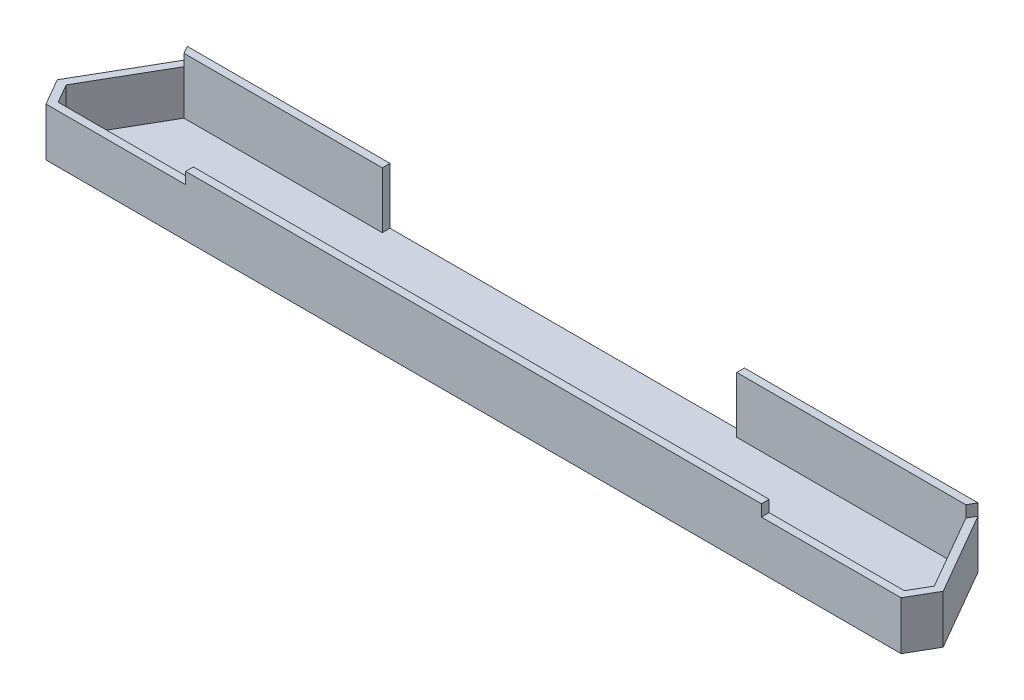
ISO-10303-21;
HEADER;
FILE_DESCRIPTION(('STEP AP214'),'2;1');
FILE_NAME('part.step','',(''),(''),'','','');
FILE_SCHEMA(('AUTOMOTIVE_DESIGN { 1 0 10303 214 1 1 1 1 }'));
ENDSEC;
DATA;
#1=APPLICATION_CONTEXT('core data for automotive mechanical design processes');
#2=APPLICATION_PROTOCOL_DEFINITION('international standard','automotive_design',2000,#1);
#3=PRODUCT_CONTEXT('',#1,'mechanical');
#4=PRODUCT('Part','Part','',(#3));
#5=PRODUCT_RELATED_PRODUCT_CATEGORY('part','',(#4));
#6=PRODUCT_DEFINITION_FORMATION('','',#4);
#7=PRODUCT_DEFINITION_CONTEXT('part definition',#1,'design');
#8=PRODUCT_DEFINITION('design','',#6,#7);
#9=PRODUCT_DEFINITION_SHAPE('','',#8);
#10=(LENGTH_UNIT() NAMED_UNIT(*) SI_UNIT(.MILLI.,.METRE.));
#11=(NAMED_UNIT(*) PLANE_ANGLE_UNIT() SI_UNIT($,.RADIAN.));
#12=(NAMED_UNIT(*) SI_UNIT($,.STERADIAN.) SOLID_ANGLE_UNIT());
#13=UNCERTAINTY_MEASURE_WITH_UNIT(LENGTH_MEASURE(1.E-05),#10,'distance_accuracy_value','');
#14=(GEOMETRIC_REPRESENTATION_CONTEXT(3) GLOBAL_UNCERTAINTY_ASSIGNED_CONTEXT((#13)) GLOBAL_UNIT_ASSIGNED_CONTEXT((#10,
#11,#12)) REPRESENTATION_CONTEXT('',''));
#15=CARTESIAN_POINT('',(0.,0.,0.));
#16=DIRECTION('',(0.,0.,1.));
#17=DIRECTION('',(1.,0.,0.));
#18=AXIS2_PLACEMENT_3D('',#15,#16,#17);
#19=CARTESIAN_POINT('',(0.,1.,0.));
#20=DIRECTION('',(0.,1.,0.));
#21=DIRECTION('',(0.,0.,1.));
#22=AXIS2_PLACEMENT_3D('',#19,#20,#21);
#23=PLANE('',#22);
#24=DIRECTION('',(1.,0.,0.));
#25=VECTOR('',#24,1.);
#26=CARTESIAN_POINT('',(-1.90825575538562E-13,1.,-19.391796769725));
#27=LINE('',#26,#25);
#28=CARTESIAN_POINT('',(-101.49473983817,1.,-19.3917967697245));
#29=VERTEX_POINT('',#28);
#30=CARTESIAN_POINT('',(-50.01,1.,-19.3917967697245));
#31=VERTEX_POINT('',#30);
#32=EDGE_CURVE('E355',#29,#31,#27,.T.);
#33=ORIENTED_EDGE('',*,*,#32,.F.);
#34=DIRECTION('',(0.500000000000004,0.,-0.866025403784436));
#35=VECTOR('',#34,1.);
#36=CARTESIAN_POINT('',(-84.5179491924306,1.,-48.7964607176055));
#37=LINE('',#36,#35);
#38=CARTESIAN_POINT('',(-112.690598923241,1.,0.));
#39=VERTEX_POINT('',#38);
#40=EDGE_CURVE('E357',#39,#29,#37,.T.);
#41=ORIENTED_EDGE('',*,*,#40,.F.);
#42=DIRECTION('',(0.499999999999998,0.,0.86602540378444));
#43=VECTOR('',#42,1.);
#44=CARTESIAN_POINT('',(-84.5179491924314,1.,48.7964607176051));
#45=LINE('',#44,#43);
#46=CARTESIAN_POINT('',(-109.845299461621,1.,4.92820323027554));
#47=VERTEX_POINT('',#46);
#48=EDGE_CURVE('E359',#39,#47,#45,.T.);
#49=ORIENTED_EDGE('',*,*,#48,.T.);
#50=DIRECTION('',(1.,0.,0.));
#51=VECTOR('',#50,1.);
#52=CARTESIAN_POINT('',(0.,1.,4.92820323027551));
#53=LINE('',#52,#51);
#54=CARTESIAN_POINT('',(109.845299461621,1.,4.92820323027552));
#55=VERTEX_POINT('',#54);
#56=EDGE_CURVE('E57',#47,#55,#53,.T.);
#57=ORIENTED_EDGE('',*,*,#56,.T.);
#58=DIRECTION('',(-0.500000000000268,0.,0.866025403784284));
#59=VECTOR('',#58,1.);
#60=CARTESIAN_POINT('',(84.5179491924025,1.,48.7964607176236));
#61=LINE('',#60,#59);
#62=CARTESIAN_POINT('',(112.690598923244,1.,0.));
#63=VERTEX_POINT('',#62);
#64=EDGE_CURVE('E47',#63,#55,#61,.T.);
#65=ORIENTED_EDGE('',*,*,#64,.F.);
#66=DIRECTION('',(0.500000000000073,0.,0.866025403784397));
#67=VECTOR('',#66,1.);
#68=CARTESIAN_POINT('',(84.5179491924244,1.,-48.7964607176109));
#69=LINE('',#68,#67);
#70=CARTESIAN_POINT('',(101.49473983817,1.,-19.3917967697245));
#71=VERTEX_POINT('',#70);
#72=EDGE_CURVE('E11',#71,#63,#69,.T.);
#73=ORIENTED_EDGE('',*,*,#72,.F.);
#74=DIRECTION('',(1.,0.,0.));
#75=VECTOR('',#74,1.);
#76=CARTESIAN_POINT('',(3.08770202801175E-13,1.,-19.3917967697261));
#77=LINE('',#76,#75);
#78=CARTESIAN_POINT('',(42.01,1.,-19.3917967697254));
#79=VERTEX_POINT('',#78);
#80=EDGE_CURVE('E265',#79,#71,#77,.T.);
#81=ORIENTED_EDGE('',*,*,#80,.F.);
#82=DIRECTION('',(0.,0.,-1.));
#83=VECTOR('',#82,1.);
#84=CARTESIAN_POINT('',(42.01,1.,0.));
#85=LINE('',#84,#83);
#86=CARTESIAN_POINT('',(42.01,1.,-21.3917967697248));
#87=VERTEX_POINT('',#86);
#88=EDGE_CURVE('E189',#79,#87,#85,.T.);
#89=ORIENTED_EDGE('',*,*,#88,.T.);
#90=DIRECTION('',(1.,0.,0.));
#91=VECTOR('',#90,1.);
#92=CARTESIAN_POINT('',(0.,1.,-21.3917967697248));
#93=LINE('',#92,#91);
#94=CARTESIAN_POINT('',(-50.01,1.,-21.3917967697248));
#95=VERTEX_POINT('',#94);
#96=EDGE_CURVE('E183',#95,#87,#93,.T.);
#97=ORIENTED_EDGE('',*,*,#96,.F.);
#98=DIRECTION('',(0.,0.,1.));
#99=VECTOR('',#98,1.);
#100=CARTESIAN_POINT('',(-50.0099999999999,1.,1.73507042067174E-13));
#101=LINE('',#100,#99);
#102=EDGE_CURVE('E186',#95,#31,#101,.T.);
#103=ORIENTED_EDGE('',*,*,#102,.T.);
#104=EDGE_LOOP('',(#33,#41,#49,#57,#65,#73,#81,#89,#97,#103));
#105=FACE_BOUND('',#104,.T.);
#106=ADVANCED_FACE('F39',(#105),#23,.T.);
#107=CARTESIAN_POINT('',(0.,0.,0.));
#108=DIRECTION('',(0.,1.,0.));
#109=DIRECTION('',(0.,0.,1.));
#110=AXIS2_PLACEMENT_3D('',#107,#108,#109);
#111=PLANE('',#110);
#112=DIRECTION('',(0.50000000000002,0.,-0.866025403784427));
#113=VECTOR('',#112,1.);
#114=CARTESIAN_POINT('',(-86.2499999999977,0.,-49.7964607176066));
#115=LINE('',#114,#113);
#116=CARTESIAN_POINT('',(-115.,0.,0.));
#117=VERTEX_POINT('',#116);
#118=CARTESIAN_POINT('',(-102.649440376549,0.,-21.3917967697245));
#119=VERTEX_POINT('',#118);
#120=EDGE_CURVE('E335',#117,#119,#115,.T.);
#121=ORIENTED_EDGE('',*,*,#120,.T.);
#122=DIRECTION('',(1.,0.,0.));
#123=VECTOR('',#122,1.);
#124=CARTESIAN_POINT('',(0.,0.,-21.391796769725));
#125=LINE('',#124,#123);
#126=CARTESIAN_POINT('',(102.649440376549,0.,-21.3917967697245));
#127=VERTEX_POINT('',#126);
#128=EDGE_CURVE('E240',#119,#127,#125,.T.);
#129=ORIENTED_EDGE('',*,*,#128,.T.);
#130=DIRECTION('',(0.500000000000021,0.,0.866025403784426));
#131=VECTOR('',#130,1.);
#132=CARTESIAN_POINT('',(86.2499999999976,0.,-49.7964607176066));
#133=LINE('',#132,#131);
#134=CARTESIAN_POINT('',(115.,0.,0.));
#135=VERTEX_POINT('',#134);
#136=EDGE_CURVE('E272',#127,#135,#133,.T.);
#137=ORIENTED_EDGE('',*,*,#136,.T.);
#138=DIRECTION('',(-0.5,0.,0.866025403784439));
#139=VECTOR('',#138,1.);
#140=CARTESIAN_POINT('',(86.25,0.,49.7964607176052));
#141=LINE('',#140,#139);
#142=CARTESIAN_POINT('',(111.,0.,6.92820323027546));
#143=VERTEX_POINT('',#142);
#144=EDGE_CURVE('E267',#135,#143,#141,.T.);
#145=ORIENTED_EDGE('',*,*,#144,.T.);
#146=DIRECTION('',(1.,0.,0.));
#147=VECTOR('',#146,1.);
#148=CARTESIAN_POINT('',(0.,0.,6.92820323027569));
#149=LINE('',#148,#147);
#150=CARTESIAN_POINT('',(-111.,0.,6.92820323027545));
#151=VERTEX_POINT('',#150);
#152=EDGE_CURVE('E310',#151,#143,#149,.T.);
#153=ORIENTED_EDGE('',*,*,#152,.F.);
#154=DIRECTION('',(0.500000000000017,0.,0.866025403784429));
#155=VECTOR('',#154,1.);
#156=CARTESIAN_POINT('',(-86.249999999998,0.,49.7964607176064));
#157=LINE('',#156,#155);
#158=EDGE_CURVE('E314',#117,#151,#157,.T.);
#159=ORIENTED_EDGE('',*,*,#158,.F.);
#160=EDGE_LOOP('',(#121,#129,#137,#145,#153,#159));
#161=FACE_BOUND('',#160,.T.);
#162=ADVANCED_FACE('F41',(#161),#111,.F.);
#163=CARTESIAN_POINT('',(0.,12.58,6.92820323027569));
#164=DIRECTION('',(0.,0.,-1.));
#165=DIRECTION('',(-1.,0.,0.));
#166=AXIS2_PLACEMENT_3D('',#163,#164,#165);
#167=PLANE('',#166);
#168=ORIENTED_EDGE('',*,*,#152,.T.);
#169=DIRECTION('',(0.,-1.,0.));
#170=VECTOR('',#169,1.);
#171=CARTESIAN_POINT('',(111.,12.58,6.92820323027546));
#172=LINE('',#171,#170);
#173=CARTESIAN_POINT('',(111.,12.58,6.92820323027546));
#174=VERTEX_POINT('',#173);
#175=EDGE_CURVE('E307',#174,#143,#172,.T.);
#176=ORIENTED_EDGE('',*,*,#175,.F.);
#177=DIRECTION('',(-1.,0.,0.));
#178=VECTOR('',#177,1.);
#179=CARTESIAN_POINT('',(0.,12.58,6.92820323027567));
#180=LINE('',#179,#178);
#181=CARTESIAN_POINT('',(74.74,12.58,6.92820323027553));
#182=VERTEX_POINT('',#181);
#183=EDGE_CURVE('E271',#174,#182,#180,.T.);
#184=ORIENTED_EDGE('',*,*,#183,.T.);
#185=DIRECTION('',(0.,-1.,0.));
#186=VECTOR('',#185,1.);
#187=CARTESIAN_POINT('',(74.74,15.58,6.92820323027553));
#188=LINE('',#187,#186);
#189=CARTESIAN_POINT('',(74.74,15.58,6.92820323027553));
#190=VERTEX_POINT('',#189);
#191=EDGE_CURVE('E237',#190,#182,#188,.T.);
#192=ORIENTED_EDGE('',*,*,#191,.F.);
#193=DIRECTION('',(-1.,0.,0.));
#194=VECTOR('',#193,1.);
#195=CARTESIAN_POINT('',(0.,15.58,6.92820323027553));
#196=LINE('',#195,#194);
#197=CARTESIAN_POINT('',(-74.74,15.58,6.92820323027553));
#198=VERTEX_POINT('',#197);
#199=EDGE_CURVE('E217',#190,#198,#196,.T.);
#200=ORIENTED_EDGE('',*,*,#199,.T.);
#201=DIRECTION('',(0.,-1.,0.));
#202=VECTOR('',#201,1.);
#203=CARTESIAN_POINT('',(-74.74,15.58,6.92820323027553));
#204=LINE('',#203,#202);
#205=CARTESIAN_POINT('',(-74.74,12.58,6.92820323027553));
#206=VERTEX_POINT('',#205);
#207=EDGE_CURVE('E228',#198,#206,#204,.T.);
#208=ORIENTED_EDGE('',*,*,#207,.T.);
#209=DIRECTION('',(1.,0.,0.));
#210=VECTOR('',#209,1.);
#211=CARTESIAN_POINT('',(0.,12.58,6.92820323027569));
#212=LINE('',#211,#210);
#213=CARTESIAN_POINT('',(-111.,12.58,6.92820323027545));
#214=VERTEX_POINT('',#213);
#215=EDGE_CURVE('E311',#214,#206,#212,.T.);
#216=ORIENTED_EDGE('',*,*,#215,.F.);
#217=DIRECTION('',(0.,-1.,0.));
#218=VECTOR('',#217,1.);
#219=CARTESIAN_POINT('',(-111.,12.58,6.92820323027545));
#220=LINE('',#219,#218);
#221=EDGE_CURVE('E333',#214,#151,#220,.T.);
#222=ORIENTED_EDGE('',*,*,#221,.T.);
#223=EDGE_LOOP('',(#168,#176,#184,#192,#200,#208,#216,#222));
#224=FACE_BOUND('',#223,.T.);
#225=ADVANCED_FACE('F378',(#224),#167,.F.);
#226=CARTESIAN_POINT('',(0.,12.58,4.92820323027551));
#227=DIRECTION('',(0.,0.,-1.));
#228=DIRECTION('',(-1.,0.,0.));
#229=AXIS2_PLACEMENT_3D('',#226,#227,#228);
#230=PLANE('',#229);
#231=DIRECTION('',(1.,0.,0.));
#232=VECTOR('',#231,1.);
#233=CARTESIAN_POINT('',(0.,12.58,4.92820323027551));
#234=LINE('',#233,#232);
#235=CARTESIAN_POINT('',(-109.845299461621,12.58,4.92820323027554));
#236=VERTEX_POINT('',#235);
#237=CARTESIAN_POINT('',(-74.74,12.58,4.92820323027553));
#238=VERTEX_POINT('',#237);
#239=EDGE_CURVE('E316',#236,#238,#234,.T.);
#240=ORIENTED_EDGE('',*,*,#239,.T.);
#241=DIRECTION('',(0.,-1.,0.));
#242=VECTOR('',#241,1.);
#243=CARTESIAN_POINT('',(-74.74,15.58,4.92820323027553));
#244=LINE('',#243,#242);
#245=CARTESIAN_POINT('',(-74.74,15.58,4.92820323027553));
#246=VERTEX_POINT('',#245);
#247=EDGE_CURVE('E231',#246,#238,#244,.T.);
#248=ORIENTED_EDGE('',*,*,#247,.F.);
#249=DIRECTION('',(1.,0.,0.));
#250=VECTOR('',#249,1.);
#251=CARTESIAN_POINT('',(0.,15.58,4.92820323027553));
#252=LINE('',#251,#250);
#253=CARTESIAN_POINT('',(74.74,15.58,4.92820323027553));
#254=VERTEX_POINT('',#253);
#255=EDGE_CURVE('E222',#246,#254,#252,.T.);
#256=ORIENTED_EDGE('',*,*,#255,.T.);
#257=DIRECTION('',(0.,-1.,0.));
#258=VECTOR('',#257,1.);
#259=CARTESIAN_POINT('',(74.74,15.58,4.92820323027553));
#260=LINE('',#259,#258);
#261=CARTESIAN_POINT('',(74.74,12.58,4.92820323027553));
#262=VERTEX_POINT('',#261);
#263=EDGE_CURVE('E234',#254,#262,#260,.T.);
#264=ORIENTED_EDGE('',*,*,#263,.T.);
#265=DIRECTION('',(-1.,0.,0.));
#266=VECTOR('',#265,1.);
#267=CARTESIAN_POINT('',(0.,12.58,4.92820323027554));
#268=LINE('',#267,#266);
#269=CARTESIAN_POINT('',(109.845299461621,12.58,4.92820323027552));
#270=VERTEX_POINT('',#269);
#271=EDGE_CURVE('E288',#270,#262,#268,.T.);
#272=ORIENTED_EDGE('',*,*,#271,.F.);
#273=DIRECTION('',(0.,-1.,0.));
#274=VECTOR('',#273,1.);
#275=CARTESIAN_POINT('',(109.845299461621,12.58,4.92820323027552));
#276=LINE('',#275,#274);
#277=EDGE_CURVE('E290',#270,#55,#276,.T.);
#278=ORIENTED_EDGE('',*,*,#277,.T.);
#279=ORIENTED_EDGE('',*,*,#56,.F.);
#280=DIRECTION('',(0.,-1.,0.));
#281=VECTOR('',#280,1.);
#282=CARTESIAN_POINT('',(-109.845299461621,12.58,4.92820323027554));
#283=LINE('',#282,#281);
#284=EDGE_CURVE('E352',#236,#47,#283,.T.);
#285=ORIENTED_EDGE('',*,*,#284,.F.);
#286=EDGE_LOOP('',(#240,#248,#256,#264,#272,#278,#279,#285));
#287=FACE_BOUND('',#286,.T.);
#288=ADVANCED_FACE('F368',(#287),#230,.T.);
#289=CARTESIAN_POINT('',(-84.5179491924314,12.58,48.7964607176051));
#290=DIRECTION('',(0.86602540378444,0.,-0.499999999999998));
#291=DIRECTION('',(-0.499999999999998,0.,-0.86602540378444));
#292=AXIS2_PLACEMENT_3D('',#289,#290,#291);
#293=PLANE('',#292);
#294=ORIENTED_EDGE('',*,*,#284,.T.);
#295=ORIENTED_EDGE('',*,*,#48,.F.);
#296=DIRECTION('',(0.,-1.,0.));
#297=VECTOR('',#296,1.);
#298=CARTESIAN_POINT('',(-112.690598923241,12.58,0.));
#299=LINE('',#298,#297);
#300=CARTESIAN_POINT('',(-112.690598923241,12.58,0.));
#301=VERTEX_POINT('',#300);
#302=EDGE_CURVE('E349',#301,#39,#299,.T.);
#303=ORIENTED_EDGE('',*,*,#302,.F.);
#304=DIRECTION('',(0.499999999999998,0.,0.86602540378444));
#305=VECTOR('',#304,1.);
#306=CARTESIAN_POINT('',(-84.5179491924314,12.58,48.7964607176051));
#307=LINE('',#306,#305);
#308=EDGE_CURVE('E319',#301,#236,#307,.T.);
#309=ORIENTED_EDGE('',*,*,#308,.T.);
#310=EDGE_LOOP('',(#294,#295,#303,#309));
#311=FACE_BOUND('',#310,.T.);
#312=ADVANCED_FACE('F423',(#311),#293,.T.);
#313=CARTESIAN_POINT('',(-84.5179491924306,12.58,-48.7964607176055));
#314=DIRECTION('',(-0.866025403784436,0.,-0.500000000000004));
#315=DIRECTION('',(-0.500000000000004,0.,0.866025403784436));
#316=AXIS2_PLACEMENT_3D('',#313,#314,#315);
#317=PLANE('',#316);
#318=ORIENTED_EDGE('',*,*,#40,.T.);
#319=DIRECTION('',(0.,-1.,0.));
#320=VECTOR('',#319,1.);
#321=CARTESIAN_POINT('',(-101.49473983817,12.58,-19.3917967697245));
#322=LINE('',#321,#320);
#323=CARTESIAN_POINT('',(-101.49473983817,12.58,-19.3917967697245));
#324=VERTEX_POINT('',#323);
#325=EDGE_CURVE('E346',#324,#29,#322,.T.);
#326=ORIENTED_EDGE('',*,*,#325,.F.);
#327=DIRECTION('',(0.500000000000004,0.,-0.866025403784436));
#328=VECTOR('',#327,1.);
#329=CARTESIAN_POINT('',(-84.5179491924306,12.58,-48.7964607176055));
#330=LINE('',#329,#328);
#331=EDGE_CURVE('E322',#301,#324,#330,.T.);
#332=ORIENTED_EDGE('',*,*,#331,.F.);
#333=ORIENTED_EDGE('',*,*,#302,.T.);
#334=EDGE_LOOP('',(#318,#326,#332,#333));
#335=FACE_BOUND('',#334,.T.);
#336=ADVANCED_FACE('F426',(#335),#317,.F.);
#337=CARTESIAN_POINT('',(-86.2499999999977,12.58,-49.7964607176066));
#338=DIRECTION('',(-0.866025403784427,0.,-0.50000000000002));
#339=DIRECTION('',(-0.50000000000002,0.,0.866025403784427));
#340=AXIS2_PLACEMENT_3D('',#337,#338,#339);
#341=PLANE('',#340);
#342=ORIENTED_EDGE('',*,*,#120,.F.);
#343=DIRECTION('',(0.,-1.,0.));
#344=VECTOR('',#343,1.);
#345=CARTESIAN_POINT('',(-115.,12.58,0.));
#346=LINE('',#345,#344);
#347=CARTESIAN_POINT('',(-115.,12.58,0.));
#348=VERTEX_POINT('',#347);
#349=EDGE_CURVE('E341',#348,#117,#346,.T.);
#350=ORIENTED_EDGE('',*,*,#349,.F.);
#351=DIRECTION('',(0.50000000000002,0.,-0.866025403784427));
#352=VECTOR('',#351,1.);
#353=CARTESIAN_POINT('',(-86.2499999999977,12.58,-49.7964607176066));
#354=LINE('',#353,#352);
#355=CARTESIAN_POINT('',(-102.649440376549,12.58,-21.3917967697245));
#356=VERTEX_POINT('',#355);
#357=EDGE_CURVE('E328',#348,#356,#354,.T.);
#358=ORIENTED_EDGE('',*,*,#357,.T.);
#359=DIRECTION('',(0.,-1.,0.));
#360=VECTOR('',#359,1.);
#361=CARTESIAN_POINT('',(-102.649440376549,12.58,-21.3917967697245));
#362=LINE('',#361,#360);
#363=EDGE_CURVE('E343',#356,#119,#362,.T.);
#364=ORIENTED_EDGE('',*,*,#363,.T.);
#365=EDGE_LOOP('',(#342,#350,#358,#364));
#366=FACE_BOUND('',#365,.T.);
#367=ADVANCED_FACE('F430',(#366),#341,.T.);
#368=CARTESIAN_POINT('',(-86.249999999998,12.58,49.7964607176064));
#369=DIRECTION('',(0.866025403784429,0.,-0.500000000000017));
#370=DIRECTION('',(-0.500000000000017,0.,-0.866025403784429));
#371=AXIS2_PLACEMENT_3D('',#368,#369,#370);
#372=PLANE('',#371);
#373=ORIENTED_EDGE('',*,*,#158,.T.);
#374=ORIENTED_EDGE('',*,*,#221,.F.);
#375=DIRECTION('',(0.500000000000017,0.,0.866025403784429));
#376=VECTOR('',#375,1.);
#377=CARTESIAN_POINT('',(-86.249999999998,12.58,49.7964607176064));
#378=LINE('',#377,#376);
#379=EDGE_CURVE('E331',#348,#214,#378,.T.);
#380=ORIENTED_EDGE('',*,*,#379,.F.);
#381=ORIENTED_EDGE('',*,*,#349,.T.);
#382=EDGE_LOOP('',(#373,#374,#380,#381));
#383=FACE_BOUND('',#382,.T.);
#384=ADVANCED_FACE('F434',(#383),#372,.F.);
#385=CARTESIAN_POINT('',(0.,12.58,0.));
#386=DIRECTION('',(0.,1.,0.));
#387=DIRECTION('',(0.,0.,1.));
#388=AXIS2_PLACEMENT_3D('',#385,#386,#387);
#389=PLANE('',#388);
#390=ORIENTED_EDGE('',*,*,#215,.T.);
#391=DIRECTION('',(0.,0.,-1.));
#392=VECTOR('',#391,1.);
#393=CARTESIAN_POINT('',(-74.74,12.58,0.));
#394=LINE('',#393,#392);
#395=EDGE_CURVE('E313',#206,#238,#394,.T.);
#396=ORIENTED_EDGE('',*,*,#395,.T.);
#397=ORIENTED_EDGE('',*,*,#239,.F.);
#398=ORIENTED_EDGE('',*,*,#308,.F.);
#399=ORIENTED_EDGE('',*,*,#331,.T.);
#400=DIRECTION('',(0.499999999999805,0.,0.866025403784551));
#401=VECTOR('',#400,1.);
#402=CARTESIAN_POINT('',(-67.7241605648466,12.58,39.1005623327353));
#403=LINE('',#402,#401);
#404=EDGE_CURVE('E325',#356,#324,#403,.T.);
#405=ORIENTED_EDGE('',*,*,#404,.F.);
#406=ORIENTED_EDGE('',*,*,#357,.F.);
#407=ORIENTED_EDGE('',*,*,#379,.T.);
#408=EDGE_LOOP('',(#390,#396,#397,#398,#399,#405,#406,#407));
#409=FACE_BOUND('',#408,.T.);
#410=ADVANCED_FACE('F438',(#409),#389,.T.);
#411=CARTESIAN_POINT('',(86.25,12.58,49.7964607176052));
#412=DIRECTION('',(0.866025403784439,0.,0.5));
#413=DIRECTION('',(0.5,0.,-0.866025403784439));
#414=AXIS2_PLACEMENT_3D('',#411,#412,#413);
#415=PLANE('',#414);
#416=ORIENTED_EDGE('',*,*,#144,.F.);
#417=DIRECTION('',(0.,-1.,0.));
#418=VECTOR('',#417,1.);
#419=CARTESIAN_POINT('',(115.,12.58,0.));
#420=LINE('',#419,#418);
#421=CARTESIAN_POINT('',(115.,12.58,0.));
#422=VERTEX_POINT('',#421);
#423=EDGE_CURVE('E305',#422,#135,#420,.T.);
#424=ORIENTED_EDGE('',*,*,#423,.F.);
#425=DIRECTION('',(-0.5,0.,0.866025403784439));
#426=VECTOR('',#425,1.);
#427=CARTESIAN_POINT('',(86.25,12.58,49.7964607176052));
#428=LINE('',#427,#426);
#429=EDGE_CURVE('E275',#422,#174,#428,.T.);
#430=ORIENTED_EDGE('',*,*,#429,.T.);
#431=ORIENTED_EDGE('',*,*,#175,.T.);
#432=EDGE_LOOP('',(#416,#424,#430,#431));
#433=FACE_BOUND('',#432,.T.);
#434=ADVANCED_FACE('F384',(#433),#415,.T.);
#435=CARTESIAN_POINT('',(86.2499999999976,12.58,-49.7964607176066));
#436=DIRECTION('',(0.866025403784426,0.,-0.500000000000021));
#437=DIRECTION('',(-0.500000000000021,0.,-0.866025403784426));
#438=AXIS2_PLACEMENT_3D('',#435,#436,#437);
#439=PLANE('',#438);
#440=ORIENTED_EDGE('',*,*,#136,.F.);
#441=DIRECTION('',(0.,-1.,0.));
#442=VECTOR('',#441,1.);
#443=CARTESIAN_POINT('',(102.649440376549,12.58,-21.3917967697245));
#444=LINE('',#443,#442);
#445=CARTESIAN_POINT('',(102.649440376549,12.58,-21.3917967697245));
#446=VERTEX_POINT('',#445);
#447=EDGE_CURVE('E303',#446,#127,#444,.T.);
#448=ORIENTED_EDGE('',*,*,#447,.F.);
#449=DIRECTION('',(0.500000000000021,0.,0.866025403784426));
#450=VECTOR('',#449,1.);
#451=CARTESIAN_POINT('',(86.2499999999976,12.58,-49.7964607176066));
#452=LINE('',#451,#450);
#453=EDGE_CURVE('E278',#446,#422,#452,.T.);
#454=ORIENTED_EDGE('',*,*,#453,.T.);
#455=ORIENTED_EDGE('',*,*,#423,.T.);
#456=EDGE_LOOP('',(#440,#448,#454,#455));
#457=FACE_BOUND('',#456,.T.);
#458=ADVANCED_FACE('F387',(#457),#439,.T.);
#459=CARTESIAN_POINT('',(84.5179491924244,12.58,-48.7964607176109));
#460=DIRECTION('',(0.866025403784396,0.,-0.500000000000073));
#461=DIRECTION('',(-0.500000000000073,0.,-0.866025403784397));
#462=AXIS2_PLACEMENT_3D('',#459,#460,#461);
#463=PLANE('',#462);
#464=ORIENTED_EDGE('',*,*,#72,.T.);
#465=DIRECTION('',(0.,-1.,0.));
#466=VECTOR('',#465,1.);
#467=CARTESIAN_POINT('',(112.690598923244,12.58,0.));
#468=LINE('',#467,#466);
#469=CARTESIAN_POINT('',(112.690598923244,12.58,0.));
#470=VERTEX_POINT('',#469);
#471=EDGE_CURVE('E297',#470,#63,#468,.T.);
#472=ORIENTED_EDGE('',*,*,#471,.F.);
#473=DIRECTION('',(0.500000000000073,0.,0.866025403784397));
#474=VECTOR('',#473,1.);
#475=CARTESIAN_POINT('',(84.5179491924244,12.58,-48.7964607176109));
#476=LINE('',#475,#474);
#477=CARTESIAN_POINT('',(101.49473983817,12.58,-19.3917967697245));
#478=VERTEX_POINT('',#477);
#479=EDGE_CURVE('E284',#478,#470,#476,.T.);
#480=ORIENTED_EDGE('',*,*,#479,.F.);
#481=DIRECTION('',(0.,-1.,0.));
#482=VECTOR('',#481,1.);
#483=CARTESIAN_POINT('',(101.49473983817,12.58,-19.3917967697245));
#484=LINE('',#483,#482);
#485=EDGE_CURVE('E300',#478,#71,#484,.T.);
#486=ORIENTED_EDGE('',*,*,#485,.T.);
#487=EDGE_LOOP('',(#464,#472,#480,#486));
#488=FACE_BOUND('',#487,.T.);
#489=ADVANCED_FACE('F392',(#488),#463,.F.);
#490=CARTESIAN_POINT('',(84.5179491924025,12.58,48.7964607176236));
#491=DIRECTION('',(0.866025403784284,0.,0.500000000000268));
#492=DIRECTION('',(0.500000000000268,0.,-0.866025403784284));
#493=AXIS2_PLACEMENT_3D('',#490,#491,#492);
#494=PLANE('',#493);
#495=ORIENTED_EDGE('',*,*,#64,.T.);
#496=ORIENTED_EDGE('',*,*,#277,.F.);
#497=DIRECTION('',(-0.500000000000268,0.,0.866025403784284));
#498=VECTOR('',#497,1.);
#499=CARTESIAN_POINT('',(84.5179491924025,12.58,48.7964607176236));
#500=LINE('',#499,#498);
#501=EDGE_CURVE('E286',#470,#270,#500,.T.);
#502=ORIENTED_EDGE('',*,*,#501,.F.);
#503=ORIENTED_EDGE('',*,*,#471,.T.);
#504=EDGE_LOOP('',(#495,#496,#502,#503));
#505=FACE_BOUND('',#504,.T.);
#506=ADVANCED_FACE('F363',(#505),#494,.F.);
#507=CARTESIAN_POINT('',(0.,12.58,0.));
#508=DIRECTION('',(0.,1.,0.));
#509=DIRECTION('',(0.,0.,1.));
#510=AXIS2_PLACEMENT_3D('',#507,#508,#509);
#511=PLANE('',#510);
#512=DIRECTION('',(0.,0.,-1.));
#513=VECTOR('',#512,1.);
#514=CARTESIAN_POINT('',(74.74,12.58,0.));
#515=LINE('',#514,#513);
#516=EDGE_CURVE('E268',#182,#262,#515,.T.);
#517=ORIENTED_EDGE('',*,*,#516,.F.);
#518=ORIENTED_EDGE('',*,*,#183,.F.);
#519=ORIENTED_EDGE('',*,*,#429,.F.);
#520=ORIENTED_EDGE('',*,*,#453,.F.);
#521=DIRECTION('',(-0.499999999999803,0.,0.866025403784552));
#522=VECTOR('',#521,1.);
#523=CARTESIAN_POINT('',(67.7241605648468,12.58,39.1005623327352));
#524=LINE('',#523,#522);
#525=EDGE_CURVE('E281',#446,#478,#524,.T.);
#526=ORIENTED_EDGE('',*,*,#525,.T.);
#527=ORIENTED_EDGE('',*,*,#479,.T.);
#528=ORIENTED_EDGE('',*,*,#501,.T.);
#529=ORIENTED_EDGE('',*,*,#271,.T.);
#530=EDGE_LOOP('',(#517,#518,#519,#520,#526,#527,#528,#529));
#531=FACE_BOUND('',#530,.T.);
#532=ADVANCED_FACE('F371',(#531),#511,.T.);
#533=CARTESIAN_POINT('',(42.01,15.58,0.));
#534=DIRECTION('',(-1.,0.,0.));
#535=DIRECTION('',(0.,0.,1.));
#536=AXIS2_PLACEMENT_3D('',#533,#534,#535);
#537=PLANE('',#536);
#538=ORIENTED_EDGE('',*,*,#88,.F.);
#539=DIRECTION('',(0.,-1.,0.));
#540=VECTOR('',#539,1.);
#541=CARTESIAN_POINT('',(42.01,15.58,-19.3917967697254));
#542=LINE('',#541,#540);
#543=CARTESIAN_POINT('',(42.01,15.58,-19.3917967697254));
#544=VERTEX_POINT('',#543);
#545=EDGE_CURVE('E262',#544,#79,#542,.T.);
#546=ORIENTED_EDGE('',*,*,#545,.F.);
#547=DIRECTION('',(0.,0.,-1.));
#548=VECTOR('',#547,1.);
#549=CARTESIAN_POINT('',(42.01,15.58,0.));
#550=LINE('',#549,#548);
#551=CARTESIAN_POINT('',(42.01,15.58,-21.3917967697248));
#552=VERTEX_POINT('',#551);
#553=EDGE_CURVE('E241',#544,#552,#550,.T.);
#554=ORIENTED_EDGE('',*,*,#553,.T.);
#555=DIRECTION('',(0.,-1.,0.));
#556=VECTOR('',#555,1.);
#557=CARTESIAN_POINT('',(42.01,15.58,-21.3917967697248));
#558=LINE('',#557,#556);
#559=EDGE_CURVE('E253',#552,#87,#558,.T.);
#560=ORIENTED_EDGE('',*,*,#559,.T.);
#561=EDGE_LOOP('',(#538,#546,#554,#560));
#562=FACE_BOUND('',#561,.T.);
#563=ADVANCED_FACE('F399',(#562),#537,.T.);
#564=CARTESIAN_POINT('',(3.08770202801175E-13,15.58,-19.3917967697261));
#565=DIRECTION('',(0.,0.,1.));
#566=DIRECTION('',(1.,0.,0.));
#567=AXIS2_PLACEMENT_3D('',#564,#565,#566);
#568=PLANE('',#567);
#569=ORIENTED_EDGE('',*,*,#545,.T.);
#570=ORIENTED_EDGE('',*,*,#80,.T.);
#571=ORIENTED_EDGE('',*,*,#485,.F.);
#572=DIRECTION('',(0.,-1.,0.));
#573=VECTOR('',#572,1.);
#574=CARTESIAN_POINT('',(101.49473983817,15.58,-19.3917967697245));
#575=LINE('',#574,#573);
#576=CARTESIAN_POINT('',(101.49473983817,15.58,-19.3917967697245));
#577=VERTEX_POINT('',#576);
#578=EDGE_CURVE('E260',#577,#478,#575,.T.);
#579=ORIENTED_EDGE('',*,*,#578,.F.);
#580=DIRECTION('',(-1.,0.,0.));
#581=VECTOR('',#580,1.);
#582=CARTESIAN_POINT('',(3.08770202801175E-13,15.58,-19.3917967697261));
#583=LINE('',#582,#581);
#584=EDGE_CURVE('E244',#577,#544,#583,.T.);
#585=ORIENTED_EDGE('',*,*,#584,.T.);
#586=EDGE_LOOP('',(#569,#570,#571,#579,#585));
#587=FACE_BOUND('',#586,.T.);
#588=ADVANCED_FACE('F395',(#587),#568,.T.);
#589=CARTESIAN_POINT('',(67.7241605648468,15.58,39.1005623327352));
#590=DIRECTION('',(0.866025403784552,0.,0.499999999999803));
#591=DIRECTION('',(0.499999999999803,0.,-0.866025403784552));
#592=AXIS2_PLACEMENT_3D('',#589,#590,#591);
#593=PLANE('',#592);
#594=ORIENTED_EDGE('',*,*,#578,.T.);
#595=ORIENTED_EDGE('',*,*,#525,.F.);
#596=DIRECTION('',(0.,-1.,0.));
#597=VECTOR('',#596,1.);
#598=CARTESIAN_POINT('',(102.649440376549,15.58,-21.3917967697245));
#599=LINE('',#598,#597);
#600=CARTESIAN_POINT('',(102.649440376549,15.58,-21.3917967697245));
#601=VERTEX_POINT('',#600);
#602=EDGE_CURVE('E257',#601,#446,#599,.T.);
#603=ORIENTED_EDGE('',*,*,#602,.F.);
#604=DIRECTION('',(-0.499999999999803,0.,0.866025403784552));
#605=VECTOR('',#604,1.);
#606=CARTESIAN_POINT('',(67.7241605648468,15.58,39.1005623327352));
#607=LINE('',#606,#605);
#608=EDGE_CURVE('E247',#601,#577,#607,.T.);
#609=ORIENTED_EDGE('',*,*,#608,.T.);
#610=EDGE_LOOP('',(#594,#595,#603,#609));
#611=FACE_BOUND('',#610,.T.);
#612=ADVANCED_FACE('F404',(#611),#593,.T.);
#613=CARTESIAN_POINT('',(0.,15.58,-21.391796769725));
#614=DIRECTION('',(0.,0.,-1.));
#615=DIRECTION('',(-1.,0.,0.));
#616=AXIS2_PLACEMENT_3D('',#613,#614,#615);
#617=PLANE('',#616);
#618=ORIENTED_EDGE('',*,*,#128,.F.);
#619=ORIENTED_EDGE('',*,*,#363,.F.);
#620=DIRECTION('',(0.,-1.,0.));
#621=VECTOR('',#620,1.);
#622=CARTESIAN_POINT('',(-102.649440376549,15.58,-21.3917967697245));
#623=LINE('',#622,#621);
#624=CARTESIAN_POINT('',(-102.649440376549,15.58,-21.3917967697245));
#625=VERTEX_POINT('',#624);
#626=EDGE_CURVE('E207',#625,#356,#623,.T.);
#627=ORIENTED_EDGE('',*,*,#626,.F.);
#628=DIRECTION('',(1.,0.,0.));
#629=VECTOR('',#628,1.);
#630=CARTESIAN_POINT('',(-1.15613914065717E-13,15.58,-21.3917967697251));
#631=LINE('',#630,#629);
#632=CARTESIAN_POINT('',(-50.01,15.58,-21.3917967697248));
#633=VERTEX_POINT('',#632);
#634=EDGE_CURVE('E206',#625,#633,#631,.T.);
#635=ORIENTED_EDGE('',*,*,#634,.T.);
#636=DIRECTION('',(0.,-1.,0.));
#637=VECTOR('',#636,1.);
#638=CARTESIAN_POINT('',(-50.01,15.58,-21.3917967697248));
#639=LINE('',#638,#637);
#640=EDGE_CURVE('E198',#633,#95,#639,.T.);
#641=ORIENTED_EDGE('',*,*,#640,.T.);
#642=ORIENTED_EDGE('',*,*,#96,.T.);
#643=ORIENTED_EDGE('',*,*,#559,.F.);
#644=DIRECTION('',(1.,0.,0.));
#645=VECTOR('',#644,1.);
#646=CARTESIAN_POINT('',(0.,15.58,-21.391796769725));
#647=LINE('',#646,#645);
#648=EDGE_CURVE('E250',#552,#601,#647,.T.);
#649=ORIENTED_EDGE('',*,*,#648,.T.);
#650=ORIENTED_EDGE('',*,*,#602,.T.);
#651=ORIENTED_EDGE('',*,*,#447,.T.);
#652=EDGE_LOOP('',(#618,#619,#627,#635,#641,#642,#643,#649,#650,#651));
#653=FACE_BOUND('',#652,.T.);
#654=ADVANCED_FACE('F204',(#653),#617,.T.);
#655=CARTESIAN_POINT('',(0.,15.58,0.));
#656=DIRECTION('',(0.,1.,0.));
#657=DIRECTION('',(0.,0.,1.));
#658=AXIS2_PLACEMENT_3D('',#655,#656,#657);
#659=PLANE('',#658);
#660=ORIENTED_EDGE('',*,*,#553,.F.);
#661=ORIENTED_EDGE('',*,*,#584,.F.);
#662=ORIENTED_EDGE('',*,*,#608,.F.);
#663=ORIENTED_EDGE('',*,*,#648,.F.);
#664=EDGE_LOOP('',(#660,#661,#662,#663));
#665=FACE_BOUND('',#664,.T.);
#666=ADVANCED_FACE('F402',(#665),#659,.T.);
#667=CARTESIAN_POINT('',(74.74,15.58,0.));
#668=DIRECTION('',(-1.,0.,0.));
#669=DIRECTION('',(0.,0.,1.));
#670=AXIS2_PLACEMENT_3D('',#667,#668,#669);
#671=PLANE('',#670);
#672=ORIENTED_EDGE('',*,*,#516,.T.);
#673=ORIENTED_EDGE('',*,*,#263,.F.);
#674=DIRECTION('',(0.,0.,-1.));
#675=VECTOR('',#674,1.);
#676=CARTESIAN_POINT('',(74.74,15.58,0.));
#677=LINE('',#676,#675);
#678=EDGE_CURVE('E220',#190,#254,#677,.T.);
#679=ORIENTED_EDGE('',*,*,#678,.F.);
#680=ORIENTED_EDGE('',*,*,#191,.T.);
#681=EDGE_LOOP('',(#672,#673,#679,#680));
#682=FACE_BOUND('',#681,.T.);
#683=ADVANCED_FACE('F374',(#682),#671,.F.);
#684=CARTESIAN_POINT('',(-74.74,15.58,0.));
#685=DIRECTION('',(-1.,0.,0.));
#686=DIRECTION('',(0.,0.,1.));
#687=AXIS2_PLACEMENT_3D('',#684,#685,#686);
#688=PLANE('',#687);
#689=ORIENTED_EDGE('',*,*,#247,.T.);
#690=ORIENTED_EDGE('',*,*,#395,.F.);
#691=ORIENTED_EDGE('',*,*,#207,.F.);
#692=DIRECTION('',(0.,0.,-1.));
#693=VECTOR('',#692,1.);
#694=CARTESIAN_POINT('',(-74.74,15.58,0.));
#695=LINE('',#694,#693);
#696=EDGE_CURVE('E225',#198,#246,#695,.T.);
#697=ORIENTED_EDGE('',*,*,#696,.T.);
#698=EDGE_LOOP('',(#689,#690,#691,#697));
#699=FACE_BOUND('',#698,.T.);
#700=ADVANCED_FACE('F646',(#699),#688,.T.);
#701=CARTESIAN_POINT('',(0.,15.58,0.));
#702=DIRECTION('',(0.,1.,0.));
#703=DIRECTION('',(0.,0.,1.));
#704=AXIS2_PLACEMENT_3D('',#701,#702,#703);
#705=PLANE('',#704);
#706=ORIENTED_EDGE('',*,*,#199,.F.);
#707=ORIENTED_EDGE('',*,*,#678,.T.);
#708=ORIENTED_EDGE('',*,*,#255,.F.);
#709=ORIENTED_EDGE('',*,*,#696,.F.);
#710=EDGE_LOOP('',(#706,#707,#708,#709));
#711=FACE_BOUND('',#710,.T.);
#712=ADVANCED_FACE('F654',(#711),#705,.T.);
#713=CARTESIAN_POINT('',(-67.7241605648466,15.58,39.1005623327353));
#714=DIRECTION('',(0.866025403784551,0.,-0.499999999999805));
#715=DIRECTION('',(-0.499999999999805,0.,-0.866025403784551));
#716=AXIS2_PLACEMENT_3D('',#713,#714,#715);
#717=PLANE('',#716);
#718=ORIENTED_EDGE('',*,*,#404,.T.);
#719=DIRECTION('',(0.,-1.,0.));
#720=VECTOR('',#719,1.);
#721=CARTESIAN_POINT('',(-101.49473983817,15.58,-19.3917967697245));
#722=LINE('',#721,#720);
#723=CARTESIAN_POINT('',(-101.49473983817,15.58,-19.3917967697245));
#724=VERTEX_POINT('',#723);
#725=EDGE_CURVE('E209',#724,#324,#722,.T.);
#726=ORIENTED_EDGE('',*,*,#725,.F.);
#727=DIRECTION('',(0.499999999999805,0.,0.866025403784551));
#728=VECTOR('',#727,1.);
#729=CARTESIAN_POINT('',(-67.7241605648466,15.58,39.1005623327353));
#730=LINE('',#729,#728);
#731=EDGE_CURVE('E677',#625,#724,#730,.T.);
#732=ORIENTED_EDGE('',*,*,#731,.F.);
#733=ORIENTED_EDGE('',*,*,#626,.T.);
#734=EDGE_LOOP('',(#718,#726,#732,#733));
#735=FACE_BOUND('',#734,.T.);
#736=ADVANCED_FACE('F483',(#735),#717,.F.);
#737=CARTESIAN_POINT('',(0.,15.58,-19.3917967697246));
#738=DIRECTION('',(0.,0.,-1.));
#739=DIRECTION('',(-1.,0.,0.));
#740=AXIS2_PLACEMENT_3D('',#737,#738,#739);
#741=PLANE('',#740);
#742=ORIENTED_EDGE('',*,*,#32,.T.);
#743=DIRECTION('',(0.,-1.,0.));
#744=VECTOR('',#743,1.);
#745=CARTESIAN_POINT('',(-50.01,15.58,-19.3917967697245));
#746=LINE('',#745,#744);
#747=CARTESIAN_POINT('',(-50.01,15.58,-19.3917967697245));
#748=VERTEX_POINT('',#747);
#749=EDGE_CURVE('E201',#748,#31,#746,.T.);
#750=ORIENTED_EDGE('',*,*,#749,.F.);
#751=DIRECTION('',(1.,0.,0.));
#752=VECTOR('',#751,1.);
#753=CARTESIAN_POINT('',(0.,15.58,-19.3917967697246));
#754=LINE('',#753,#752);
#755=EDGE_CURVE('E674',#724,#748,#754,.T.);
#756=ORIENTED_EDGE('',*,*,#755,.F.);
#757=ORIENTED_EDGE('',*,*,#725,.T.);
#758=ORIENTED_EDGE('',*,*,#325,.T.);
#759=EDGE_LOOP('',(#742,#750,#756,#757,#758));
#760=FACE_BOUND('',#759,.T.);
#761=ADVANCED_FACE('F478',(#760),#741,.F.);
#762=CARTESIAN_POINT('',(-50.0099999999999,15.58,1.73507042067174E-13));
#763=DIRECTION('',(1.,0.,0.));
#764=DIRECTION('',(0.,0.,-1.));
#765=AXIS2_PLACEMENT_3D('',#762,#763,#764);
#766=PLANE('',#765);
#767=ORIENTED_EDGE('',*,*,#102,.F.);
#768=ORIENTED_EDGE('',*,*,#640,.F.);
#769=DIRECTION('',(0.,0.,1.));
#770=VECTOR('',#769,1.);
#771=CARTESIAN_POINT('',(-50.0099999999999,15.58,1.73507042067174E-13));
#772=LINE('',#771,#770);
#773=EDGE_CURVE('E676',#633,#748,#772,.T.);
#774=ORIENTED_EDGE('',*,*,#773,.T.);
#775=ORIENTED_EDGE('',*,*,#749,.T.);
#776=EDGE_LOOP('',(#767,#768,#774,#775));
#777=FACE_BOUND('',#776,.T.);
#778=ADVANCED_FACE('F196',(#777),#766,.T.);
#779=CARTESIAN_POINT('',(0.,15.58,0.));
#780=DIRECTION('',(0.,1.,0.));
#781=DIRECTION('',(0.,0.,1.));
#782=AXIS2_PLACEMENT_3D('',#779,#780,#781);
#783=PLANE('',#782);
#784=ORIENTED_EDGE('',*,*,#731,.T.);
#785=ORIENTED_EDGE('',*,*,#755,.T.);
#786=ORIENTED_EDGE('',*,*,#773,.F.);
#787=ORIENTED_EDGE('',*,*,#634,.F.);
#788=EDGE_LOOP('',(#784,#785,#786,#787));
#789=FACE_BOUND('',#788,.T.);
#790=ADVANCED_FACE('F494',(#789),#783,.T.);
#791=CLOSED_SHELL('',(#106,#162,#225,#288,#312,#336,#367,#384,#410,#434,#458,#489,#506,#532,
#563,#588,#612,#654,#666,#683,#700,#712,#736,#761,#778,#790));
#792=MANIFOLD_SOLID_BREP('B2',#791);
#793=ADVANCED_BREP_SHAPE_REPRESENTATION('',(#18,#792),#14);
#794=SHAPE_DEFINITION_REPRESENTATION(#9,#793);
ENDSEC;
END-ISO-10303-21;
